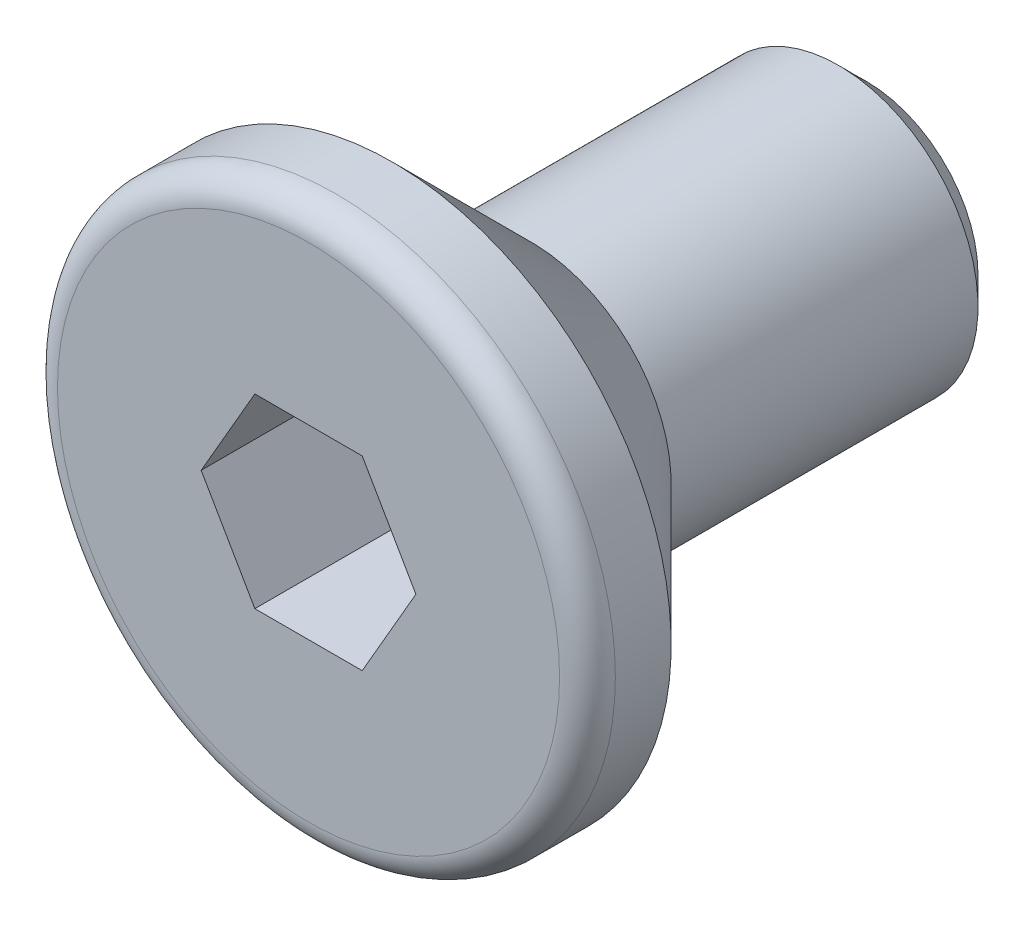
ISO-10303-21;
HEADER;
FILE_DESCRIPTION(('STEP AP214'),'2;1');
FILE_NAME('part.step','',(''),(''),'','','');
FILE_SCHEMA(('AUTOMOTIVE_DESIGN { 1 0 10303 214 1 1 1 1 }'));
ENDSEC;
DATA;
#1=APPLICATION_CONTEXT('core data for automotive mechanical design processes');
#2=APPLICATION_PROTOCOL_DEFINITION('international standard','automotive_design',2000,#1);
#3=PRODUCT_CONTEXT('',#1,'mechanical');
#4=PRODUCT('Part','Part','',(#3));
#5=PRODUCT_RELATED_PRODUCT_CATEGORY('part','',(#4));
#6=PRODUCT_DEFINITION_FORMATION('','',#4);
#7=PRODUCT_DEFINITION_CONTEXT('part definition',#1,'design');
#8=PRODUCT_DEFINITION('design','',#6,#7);
#9=PRODUCT_DEFINITION_SHAPE('','',#8);
#10=(LENGTH_UNIT() NAMED_UNIT(*) SI_UNIT(.MILLI.,.METRE.));
#11=(NAMED_UNIT(*) PLANE_ANGLE_UNIT() SI_UNIT($,.RADIAN.));
#12=(NAMED_UNIT(*) SI_UNIT($,.STERADIAN.) SOLID_ANGLE_UNIT());
#13=UNCERTAINTY_MEASURE_WITH_UNIT(LENGTH_MEASURE(1.E-05),#10,'distance_accuracy_value','');
#14=(GEOMETRIC_REPRESENTATION_CONTEXT(3) GLOBAL_UNCERTAINTY_ASSIGNED_CONTEXT((#13)) GLOBAL_UNIT_ASSIGNED_CONTEXT((#10,
#11,#12)) REPRESENTATION_CONTEXT('',''));
#15=CARTESIAN_POINT('',(0.,0.,0.));
#16=DIRECTION('',(0.,0.,1.));
#17=DIRECTION('',(1.,0.,0.));
#18=AXIS2_PLACEMENT_3D('',#15,#16,#17);
#19=CARTESIAN_POINT('',(0.,0.,3.));
#20=DIRECTION('',(0.,0.,1.));
#21=DIRECTION('',(1.,0.,0.));
#22=AXIS2_PLACEMENT_3D('',#19,#20,#21);
#23=PLANE('',#22);
#24=CARTESIAN_POINT('',(0.,0.,3.));
#25=DIRECTION('',(0.,0.,1.));
#26=DIRECTION('',(1.,0.,0.));
#27=AXIS2_PLACEMENT_3D('',#24,#25,#26);
#28=CIRCLE('',#27,2.7);
#29=CARTESIAN_POINT('',(2.7,0.,3.));
#30=VERTEX_POINT('',#29);
#31=EDGE_CURVE('E11',#30,#30,#28,.T.);
#32=ORIENTED_EDGE('',*,*,#31,.T.);
#33=EDGE_LOOP('',(#32));
#34=FACE_BOUND('',#33,.T.);
#35=DIRECTION('',(0.5,0.866025403784439,0.));
#36=VECTOR('',#35,1.);
#37=CARTESIAN_POINT('',(0.577350269189626,-1.,3.));
#38=LINE('',#37,#36);
#39=CARTESIAN_POINT('',(0.577350269189626,-1.,3.));
#40=VERTEX_POINT('',#39);
#41=CARTESIAN_POINT('',(1.15470053837925,0.,3.));
#42=VERTEX_POINT('',#41);
#43=EDGE_CURVE('E50',#40,#42,#38,.T.);
#44=ORIENTED_EDGE('',*,*,#43,.F.);
#45=DIRECTION('',(1.,0.,0.));
#46=VECTOR('',#45,1.);
#47=CARTESIAN_POINT('',(-0.577350269189626,-1.,3.));
#48=LINE('',#47,#46);
#49=CARTESIAN_POINT('',(-0.577350269189626,-1.,3.));
#50=VERTEX_POINT('',#49);
#51=EDGE_CURVE('E133',#50,#40,#48,.T.);
#52=ORIENTED_EDGE('',*,*,#51,.F.);
#53=DIRECTION('',(0.5,-0.866025403784438,0.));
#54=VECTOR('',#53,1.);
#55=CARTESIAN_POINT('',(-1.15470053837925,0.,3.));
#56=LINE('',#55,#54);
#57=CARTESIAN_POINT('',(-1.15470053837925,0.,3.));
#58=VERTEX_POINT('',#57);
#59=EDGE_CURVE('E131',#58,#50,#56,.T.);
#60=ORIENTED_EDGE('',*,*,#59,.F.);
#61=DIRECTION('',(-0.5,-0.866025403784439,0.));
#62=VECTOR('',#61,1.);
#63=CARTESIAN_POINT('',(-0.577350269189626,1.,3.));
#64=LINE('',#63,#62);
#65=CARTESIAN_POINT('',(-0.577350269189626,1.,3.));
#66=VERTEX_POINT('',#65);
#67=EDGE_CURVE('E98',#66,#58,#64,.T.);
#68=ORIENTED_EDGE('',*,*,#67,.F.);
#69=DIRECTION('',(-1.,0.,0.));
#70=VECTOR('',#69,1.);
#71=CARTESIAN_POINT('',(0.577350269189626,1.,3.));
#72=LINE('',#71,#70);
#73=CARTESIAN_POINT('',(0.577350269189626,1.,3.));
#74=VERTEX_POINT('',#73);
#75=EDGE_CURVE('E127',#74,#66,#72,.T.);
#76=ORIENTED_EDGE('',*,*,#75,.F.);
#77=DIRECTION('',(-0.5,0.866025403784438,0.));
#78=VECTOR('',#77,1.);
#79=CARTESIAN_POINT('',(1.15470053837925,0.,3.));
#80=LINE('',#79,#78);
#81=EDGE_CURVE('E124',#42,#74,#80,.T.);
#82=ORIENTED_EDGE('',*,*,#81,.F.);
#83=EDGE_LOOP('',(#44,#52,#60,#68,#76,#82));
#84=FACE_BOUND('',#83,.T.);
#85=ADVANCED_FACE('F35',(#34,#84),#23,.T.);
#86=CARTESIAN_POINT('',(0.,0.,-3.));
#87=DIRECTION('',(0.,0.,-1.));
#88=DIRECTION('',(-1.,0.,0.));
#89=AXIS2_PLACEMENT_3D('',#86,#87,#88);
#90=CYLINDRICAL_SURFACE('',#89,3.);
#91=CARTESIAN_POINT('',(0.,0.,2.7));
#92=DIRECTION('',(0.,0.,1.));
#93=DIRECTION('',(1.,0.,0.));
#94=AXIS2_PLACEMENT_3D('',#91,#92,#93);
#95=CIRCLE('',#94,3.);
#96=CARTESIAN_POINT('',(3.,0.,2.7));
#97=VERTEX_POINT('',#96);
#98=EDGE_CURVE('E43',#97,#97,#95,.F.);
#99=ORIENTED_EDGE('',*,*,#98,.T.);
#100=EDGE_LOOP('',(#99));
#101=FACE_BOUND('',#100,.T.);
#102=CARTESIAN_POINT('',(0.,0.,2.10000000000002));
#103=DIRECTION('',(0.,0.,-1.));
#104=DIRECTION('',(-1.,0.,0.));
#105=AXIS2_PLACEMENT_3D('',#102,#103,#104);
#106=CIRCLE('',#105,3.);
#107=CARTESIAN_POINT('',(-3.,0.,2.10000000000002));
#108=VERTEX_POINT('',#107);
#109=EDGE_CURVE('E151',#108,#108,#106,.T.);
#110=ORIENTED_EDGE('',*,*,#109,.F.);
#111=EDGE_LOOP('',(#110));
#112=FACE_BOUND('',#111,.T.);
#113=ADVANCED_FACE('F156',(#101,#112),#90,.T.);
#114=CARTESIAN_POINT('',(0.,0.,0.6));
#115=DIRECTION('',(0.,0.,1.));
#116=DIRECTION('',(1.,0.,0.));
#117=AXIS2_PLACEMENT_3D('',#114,#115,#116);
#118=CONICAL_SURFACE('',#117,1.5,0.785398163397443);
#119=ORIENTED_EDGE('',*,*,#109,.T.);
#120=EDGE_LOOP('',(#119));
#121=FACE_BOUND('',#120,.T.);
#122=CARTESIAN_POINT('',(0.,0.,0.6));
#123=DIRECTION('',(0.,0.,-1.));
#124=DIRECTION('',(-1.,0.,0.));
#125=AXIS2_PLACEMENT_3D('',#122,#123,#124);
#126=CIRCLE('',#125,1.5);
#127=CARTESIAN_POINT('',(-1.5,0.,0.6));
#128=VERTEX_POINT('',#127);
#129=EDGE_CURVE('E148',#128,#128,#126,.T.);
#130=ORIENTED_EDGE('',*,*,#129,.F.);
#131=EDGE_LOOP('',(#130));
#132=FACE_BOUND('',#131,.T.);
#133=ADVANCED_FACE('F172',(#121,#132),#118,.T.);
#134=CARTESIAN_POINT('',(0.,0.,-3.));
#135=DIRECTION('',(0.,0.,-1.));
#136=DIRECTION('',(-1.,0.,0.));
#137=AXIS2_PLACEMENT_3D('',#134,#135,#136);
#138=CYLINDRICAL_SURFACE('',#137,1.5);
#139=ORIENTED_EDGE('',*,*,#129,.T.);
#140=EDGE_LOOP('',(#139));
#141=FACE_BOUND('',#140,.T.);
#142=CARTESIAN_POINT('',(0.,0.,-2.7));
#143=DIRECTION('',(0.,0.,-1.));
#144=DIRECTION('',(-1.,0.,0.));
#145=AXIS2_PLACEMENT_3D('',#142,#143,#144);
#146=CIRCLE('',#145,1.5);
#147=CARTESIAN_POINT('',(-1.5,0.,-2.7));
#148=VERTEX_POINT('',#147);
#149=EDGE_CURVE('E145',#148,#148,#146,.T.);
#150=ORIENTED_EDGE('',*,*,#149,.F.);
#151=EDGE_LOOP('',(#150));
#152=FACE_BOUND('',#151,.T.);
#153=ADVANCED_FACE('F178',(#141,#152),#138,.T.);
#154=CARTESIAN_POINT('',(0.,0.,-3.));
#155=DIRECTION('',(0.,0.,1.));
#156=DIRECTION('',(1.,0.,0.));
#157=AXIS2_PLACEMENT_3D('',#154,#155,#156);
#158=CONICAL_SURFACE('',#157,1.2,0.785398163397443);
#159=ORIENTED_EDGE('',*,*,#149,.T.);
#160=EDGE_LOOP('',(#159));
#161=FACE_BOUND('',#160,.T.);
#162=CARTESIAN_POINT('',(0.,0.,-3.));
#163=DIRECTION('',(0.,0.,-1.));
#164=DIRECTION('',(-1.,0.,0.));
#165=AXIS2_PLACEMENT_3D('',#162,#163,#164);
#166=CIRCLE('',#165,1.2);
#167=CARTESIAN_POINT('',(-1.2,0.,-3.));
#168=VERTEX_POINT('',#167);
#169=EDGE_CURVE('E137',#168,#168,#166,.T.);
#170=ORIENTED_EDGE('',*,*,#169,.F.);
#171=EDGE_LOOP('',(#170));
#172=FACE_BOUND('',#171,.T.);
#173=ADVANCED_FACE('F182',(#161,#172),#158,.T.);
#174=CARTESIAN_POINT('',(0.,1.2,-3.));
#175=DIRECTION('',(0.,0.,-1.));
#176=DIRECTION('',(-1.,0.,0.));
#177=AXIS2_PLACEMENT_3D('',#174,#175,#176);
#178=PLANE('',#177);
#179=ORIENTED_EDGE('',*,*,#169,.T.);
#180=EDGE_LOOP('',(#179));
#181=FACE_BOUND('',#180,.T.);
#182=ADVANCED_FACE('F186',(#181),#178,.T.);
#183=CARTESIAN_POINT('',(0.577350269189626,-1.,1.5));
#184=DIRECTION('',(0.866025403784438,-0.5,0.));
#185=DIRECTION('',(0.5,0.866025403784439,0.));
#186=AXIS2_PLACEMENT_3D('',#183,#184,#185);
#187=PLANE('',#186);
#188=ORIENTED_EDGE('',*,*,#43,.T.);
#189=DIRECTION('',(0.,0.,1.));
#190=VECTOR('',#189,1.);
#191=CARTESIAN_POINT('',(1.15470053837925,0.,1.5));
#192=LINE('',#191,#190);
#193=CARTESIAN_POINT('',(1.15470053837925,0.,1.5));
#194=VERTEX_POINT('',#193);
#195=EDGE_CURVE('E80',#194,#42,#192,.T.);
#196=ORIENTED_EDGE('',*,*,#195,.F.);
#197=DIRECTION('',(0.5,0.866025403784439,0.));
#198=VECTOR('',#197,1.);
#199=CARTESIAN_POINT('',(0.577350269189626,-1.,1.5));
#200=LINE('',#199,#198);
#201=CARTESIAN_POINT('',(0.577350269189626,-1.,1.5));
#202=VERTEX_POINT('',#201);
#203=EDGE_CURVE('E135',#202,#194,#200,.T.);
#204=ORIENTED_EDGE('',*,*,#203,.F.);
#205=DIRECTION('',(0.,0.,1.));
#206=VECTOR('',#205,1.);
#207=CARTESIAN_POINT('',(0.577350269189626,-1.,1.5));
#208=LINE('',#207,#206);
#209=EDGE_CURVE('E58',#202,#40,#208,.T.);
#210=ORIENTED_EDGE('',*,*,#209,.T.);
#211=EDGE_LOOP('',(#188,#196,#204,#210));
#212=FACE_BOUND('',#211,.T.);
#213=ADVANCED_FACE('F190',(#212),#187,.F.);
#214=CARTESIAN_POINT('',(-0.577350269189626,-1.,1.5));
#215=DIRECTION('',(0.,-1.,0.));
#216=DIRECTION('',(1.,0.,0.));
#217=AXIS2_PLACEMENT_3D('',#214,#215,#216);
#218=PLANE('',#217);
#219=ORIENTED_EDGE('',*,*,#51,.T.);
#220=ORIENTED_EDGE('',*,*,#209,.F.);
#221=DIRECTION('',(1.,0.,0.));
#222=VECTOR('',#221,1.);
#223=CARTESIAN_POINT('',(-0.577350269189626,-1.,1.5));
#224=LINE('',#223,#222);
#225=CARTESIAN_POINT('',(-0.577350269189626,-1.,1.5));
#226=VERTEX_POINT('',#225);
#227=EDGE_CURVE('E110',#226,#202,#224,.T.);
#228=ORIENTED_EDGE('',*,*,#227,.F.);
#229=DIRECTION('',(0.,0.,1.));
#230=VECTOR('',#229,1.);
#231=CARTESIAN_POINT('',(-0.577350269189626,-1.,1.5));
#232=LINE('',#231,#230);
#233=EDGE_CURVE('E102',#226,#50,#232,.T.);
#234=ORIENTED_EDGE('',*,*,#233,.T.);
#235=EDGE_LOOP('',(#219,#220,#228,#234));
#236=FACE_BOUND('',#235,.T.);
#237=ADVANCED_FACE('F194',(#236),#218,.F.);
#238=CARTESIAN_POINT('',(-1.15470053837925,0.,1.5));
#239=DIRECTION('',(-0.866025403784439,-0.5,0.));
#240=DIRECTION('',(0.5,-0.866025403784439,0.));
#241=AXIS2_PLACEMENT_3D('',#238,#239,#240);
#242=PLANE('',#241);
#243=ORIENTED_EDGE('',*,*,#59,.T.);
#244=ORIENTED_EDGE('',*,*,#233,.F.);
#245=DIRECTION('',(0.5,-0.866025403784438,0.));
#246=VECTOR('',#245,1.);
#247=CARTESIAN_POINT('',(-1.15470053837925,0.,1.5));
#248=LINE('',#247,#246);
#249=CARTESIAN_POINT('',(-1.15470053837925,0.,1.5));
#250=VERTEX_POINT('',#249);
#251=EDGE_CURVE('E106',#250,#226,#248,.T.);
#252=ORIENTED_EDGE('',*,*,#251,.F.);
#253=DIRECTION('',(0.,0.,1.));
#254=VECTOR('',#253,1.);
#255=CARTESIAN_POINT('',(-1.15470053837925,0.,1.5));
#256=LINE('',#255,#254);
#257=EDGE_CURVE('E91',#250,#58,#256,.T.);
#258=ORIENTED_EDGE('',*,*,#257,.T.);
#259=EDGE_LOOP('',(#243,#244,#252,#258));
#260=FACE_BOUND('',#259,.T.);
#261=ADVANCED_FACE('F107',(#260),#242,.F.);
#262=CARTESIAN_POINT('',(-0.577350269189626,1.,1.5));
#263=DIRECTION('',(-0.866025403784439,0.5,0.));
#264=DIRECTION('',(-0.5,-0.866025403784439,0.));
#265=AXIS2_PLACEMENT_3D('',#262,#263,#264);
#266=PLANE('',#265);
#267=ORIENTED_EDGE('',*,*,#67,.T.);
#268=ORIENTED_EDGE('',*,*,#257,.F.);
#269=DIRECTION('',(-0.5,-0.866025403784439,0.));
#270=VECTOR('',#269,1.);
#271=CARTESIAN_POINT('',(-0.577350269189626,1.,1.5));
#272=LINE('',#271,#270);
#273=CARTESIAN_POINT('',(-0.577350269189626,1.,1.5));
#274=VERTEX_POINT('',#273);
#275=EDGE_CURVE('E95',#274,#250,#272,.T.);
#276=ORIENTED_EDGE('',*,*,#275,.F.);
#277=DIRECTION('',(0.,0.,1.));
#278=VECTOR('',#277,1.);
#279=CARTESIAN_POINT('',(-0.577350269189626,1.,1.5));
#280=LINE('',#279,#278);
#281=EDGE_CURVE('E103',#274,#66,#280,.T.);
#282=ORIENTED_EDGE('',*,*,#281,.T.);
#283=EDGE_LOOP('',(#267,#268,#276,#282));
#284=FACE_BOUND('',#283,.T.);
#285=ADVANCED_FACE('F93',(#284),#266,.F.);
#286=CARTESIAN_POINT('',(0.577350269189626,1.,1.5));
#287=DIRECTION('',(0.,1.,0.));
#288=DIRECTION('',(-1.,0.,0.));
#289=AXIS2_PLACEMENT_3D('',#286,#287,#288);
#290=PLANE('',#289);
#291=ORIENTED_EDGE('',*,*,#75,.T.);
#292=ORIENTED_EDGE('',*,*,#281,.F.);
#293=DIRECTION('',(-1.,0.,0.));
#294=VECTOR('',#293,1.);
#295=CARTESIAN_POINT('',(0.577350269189626,1.,1.5));
#296=LINE('',#295,#294);
#297=CARTESIAN_POINT('',(0.577350269189626,1.,1.5));
#298=VERTEX_POINT('',#297);
#299=EDGE_CURVE('E116',#298,#274,#296,.T.);
#300=ORIENTED_EDGE('',*,*,#299,.F.);
#301=DIRECTION('',(0.,0.,1.));
#302=VECTOR('',#301,1.);
#303=CARTESIAN_POINT('',(0.577350269189626,1.,1.5));
#304=LINE('',#303,#302);
#305=EDGE_CURVE('E140',#298,#74,#304,.T.);
#306=ORIENTED_EDGE('',*,*,#305,.T.);
#307=EDGE_LOOP('',(#291,#292,#300,#306));
#308=FACE_BOUND('',#307,.T.);
#309=ADVANCED_FACE('F197',(#308),#290,.F.);
#310=CARTESIAN_POINT('',(1.15470053837925,0.,1.5));
#311=DIRECTION('',(0.866025403784439,0.5,0.));
#312=DIRECTION('',(-0.5,0.866025403784439,0.));
#313=AXIS2_PLACEMENT_3D('',#310,#311,#312);
#314=PLANE('',#313);
#315=ORIENTED_EDGE('',*,*,#81,.T.);
#316=ORIENTED_EDGE('',*,*,#305,.F.);
#317=DIRECTION('',(-0.5,0.866025403784438,0.));
#318=VECTOR('',#317,1.);
#319=CARTESIAN_POINT('',(1.15470053837925,0.,1.5));
#320=LINE('',#319,#318);
#321=EDGE_CURVE('E118',#194,#298,#320,.T.);
#322=ORIENTED_EDGE('',*,*,#321,.F.);
#323=ORIENTED_EDGE('',*,*,#195,.T.);
#324=EDGE_LOOP('',(#315,#316,#322,#323));
#325=FACE_BOUND('',#324,.T.);
#326=ADVANCED_FACE('F164',(#325),#314,.F.);
#327=CARTESIAN_POINT('',(0.,0.,1.5));
#328=DIRECTION('',(0.,0.,1.));
#329=DIRECTION('',(1.,0.,0.));
#330=AXIS2_PLACEMENT_3D('',#327,#328,#329);
#331=PLANE('',#330);
#332=ORIENTED_EDGE('',*,*,#203,.T.);
#333=ORIENTED_EDGE('',*,*,#321,.T.);
#334=ORIENTED_EDGE('',*,*,#299,.T.);
#335=ORIENTED_EDGE('',*,*,#275,.T.);
#336=ORIENTED_EDGE('',*,*,#251,.T.);
#337=ORIENTED_EDGE('',*,*,#227,.T.);
#338=EDGE_LOOP('',(#332,#333,#334,#335,#336,#337));
#339=FACE_BOUND('',#338,.T.);
#340=ADVANCED_FACE('F113',(#339),#331,.T.);
#341=CARTESIAN_POINT('',(0.,0.,2.7));
#342=DIRECTION('',(0.,0.,1.));
#343=DIRECTION('',(1.,0.,0.));
#344=AXIS2_PLACEMENT_3D('',#341,#342,#343);
#345=TOROIDAL_SURFACE('',#344,2.7,0.3);
#346=ORIENTED_EDGE('',*,*,#31,.F.);
#347=EDGE_LOOP('',(#346));
#348=FACE_BOUND('',#347,.T.);
#349=ORIENTED_EDGE('',*,*,#98,.F.);
#350=EDGE_LOOP('',(#349));
#351=FACE_BOUND('',#350,.T.);
#352=ADVANCED_FACE('F37',(#348,#351),#345,.T.);
#353=CLOSED_SHELL('',(#85,#113,#133,#153,#173,#182,#213,#237,#261,#285,#309,#326,#340,#352));
#354=MANIFOLD_SOLID_BREP('B2',#353);
#355=ADVANCED_BREP_SHAPE_REPRESENTATION('',(#18,#354),#14);
#356=SHAPE_DEFINITION_REPRESENTATION(#9,#355);
ENDSEC;
END-ISO-10303-21;
